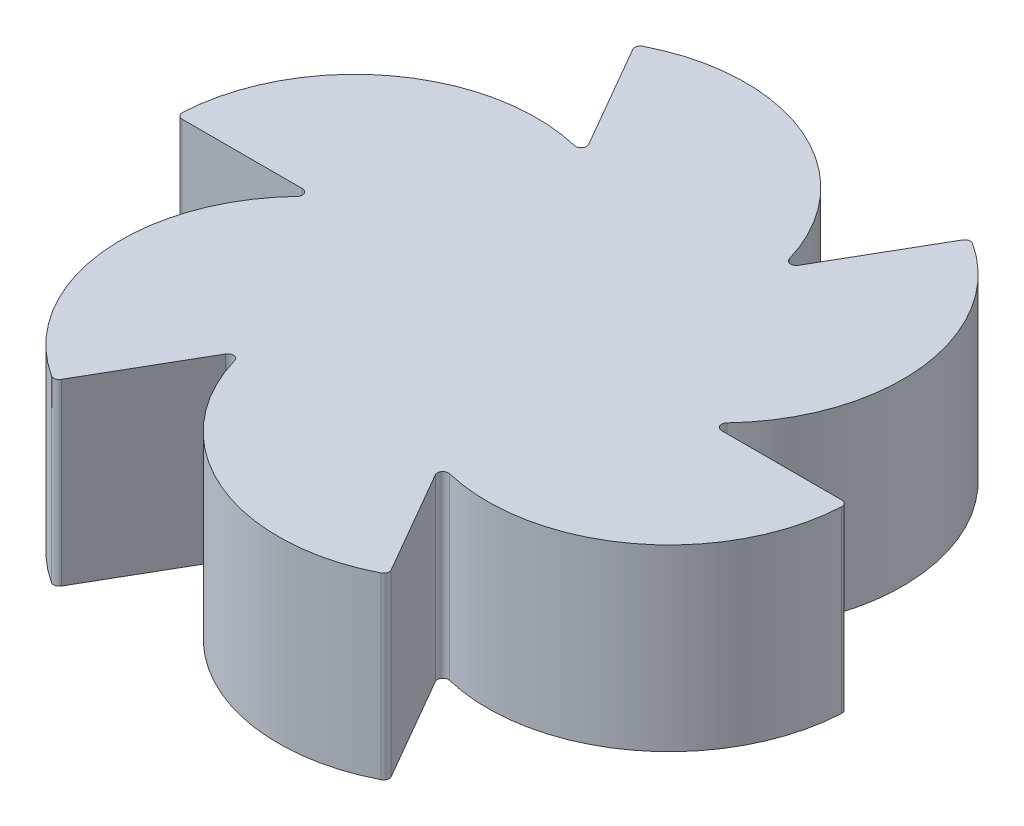
ISO-10303-21;
HEADER;
FILE_DESCRIPTION(('STEP AP214'),'2;1');
FILE_NAME('part.step','',(''),(''),'','','');
FILE_SCHEMA(('AUTOMOTIVE_DESIGN { 1 0 10303 214 1 1 1 1 }'));
ENDSEC;
DATA;
#1=APPLICATION_CONTEXT('core data for automotive mechanical design processes');
#2=APPLICATION_PROTOCOL_DEFINITION('international standard','automotive_design',2000,#1);
#3=PRODUCT_CONTEXT('',#1,'mechanical');
#4=PRODUCT('Part','Part','',(#3));
#5=PRODUCT_RELATED_PRODUCT_CATEGORY('part','',(#4));
#6=PRODUCT_DEFINITION_FORMATION('','',#4);
#7=PRODUCT_DEFINITION_CONTEXT('part definition',#1,'design');
#8=PRODUCT_DEFINITION('design','',#6,#7);
#9=PRODUCT_DEFINITION_SHAPE('','',#8);
#10=(LENGTH_UNIT() NAMED_UNIT(*) SI_UNIT(.MILLI.,.METRE.));
#11=(NAMED_UNIT(*) PLANE_ANGLE_UNIT() SI_UNIT($,.RADIAN.));
#12=(NAMED_UNIT(*) SI_UNIT($,.STERADIAN.) SOLID_ANGLE_UNIT());
#13=UNCERTAINTY_MEASURE_WITH_UNIT(LENGTH_MEASURE(1.E-05),#10,'distance_accuracy_value','');
#14=(GEOMETRIC_REPRESENTATION_CONTEXT(3) GLOBAL_UNCERTAINTY_ASSIGNED_CONTEXT((#13)) GLOBAL_UNIT_ASSIGNED_CONTEXT((#10,
#11,#12)) REPRESENTATION_CONTEXT('',''));
#15=CARTESIAN_POINT('',(0.,0.,0.));
#16=DIRECTION('',(0.,0.,1.));
#17=DIRECTION('',(1.,0.,0.));
#18=AXIS2_PLACEMENT_3D('',#15,#16,#17);
#19=CARTESIAN_POINT('',(0.,0.,0.));
#20=DIRECTION('',(0.,1.,0.));
#21=DIRECTION('',(0.,0.,1.));
#22=AXIS2_PLACEMENT_3D('',#19,#20,#21);
#23=PLANE('',#22);
#24=CARTESIAN_POINT('',(0.,0.,0.));
#25=DIRECTION('',(0.,-1.,0.));
#26=DIRECTION('',(0.,0.,-1.));
#27=AXIS2_PLACEMENT_3D('',#24,#25,#26);
#28=CIRCLE('',#27,4.3);
#29=CARTESIAN_POINT('',(0.,0.,-4.3));
#30=VERTEX_POINT('',#29);
#31=EDGE_CURVE('E448',#30,#30,#28,.T.);
#32=ORIENTED_EDGE('',*,*,#31,.T.);
#33=EDGE_LOOP('',(#32));
#34=FACE_BOUND('',#33,.T.);
#35=DIRECTION('',(0.5,0.,-0.866025403784439));
#36=VECTOR('',#35,1.);
#37=CARTESIAN_POINT('',(-2.25166604983954,0.,0.));
#38=LINE('',#37,#36);
#39=CARTESIAN_POINT('',(-2.25166604983954,0.,0.));
#40=VERTEX_POINT('',#39);
#41=CARTESIAN_POINT('',(-1.12583302491977,0.,-1.95));
#42=VERTEX_POINT('',#41);
#43=EDGE_CURVE('E445',#40,#42,#38,.T.);
#44=ORIENTED_EDGE('',*,*,#43,.F.);
#45=DIRECTION('',(-0.5,0.,-0.866025403784439));
#46=VECTOR('',#45,1.);
#47=CARTESIAN_POINT('',(-1.12583302491977,0.,1.95));
#48=LINE('',#47,#46);
#49=CARTESIAN_POINT('',(-1.12583302491977,0.,1.95));
#50=VERTEX_POINT('',#49);
#51=EDGE_CURVE('E433',#50,#40,#48,.T.);
#52=ORIENTED_EDGE('',*,*,#51,.F.);
#53=DIRECTION('',(-1.,0.,0.));
#54=VECTOR('',#53,1.);
#55=CARTESIAN_POINT('',(1.12583302491977,0.,1.95));
#56=LINE('',#55,#54);
#57=CARTESIAN_POINT('',(1.12583302491977,0.,1.95));
#58=VERTEX_POINT('',#57);
#59=EDGE_CURVE('E436',#58,#50,#56,.T.);
#60=ORIENTED_EDGE('',*,*,#59,.F.);
#61=DIRECTION('',(-0.5,0.,0.866025403784439));
#62=VECTOR('',#61,1.);
#63=CARTESIAN_POINT('',(2.25166604983954,0.,0.));
#64=LINE('',#63,#62);
#65=CARTESIAN_POINT('',(2.25166604983954,0.,0.));
#66=VERTEX_POINT('',#65);
#67=EDGE_CURVE('E440',#66,#58,#64,.T.);
#68=ORIENTED_EDGE('',*,*,#67,.F.);
#69=DIRECTION('',(0.5,0.,0.866025403784439));
#70=VECTOR('',#69,1.);
#71=CARTESIAN_POINT('',(1.12583302491977,0.,-1.95));
#72=LINE('',#71,#70);
#73=CARTESIAN_POINT('',(1.12583302491977,0.,-1.95));
#74=VERTEX_POINT('',#73);
#75=EDGE_CURVE('E148',#74,#66,#72,.T.);
#76=ORIENTED_EDGE('',*,*,#75,.F.);
#77=DIRECTION('',(1.,0.,0.));
#78=VECTOR('',#77,1.);
#79=CARTESIAN_POINT('',(-1.12583302491977,0.,-1.95));
#80=LINE('',#79,#78);
#81=EDGE_CURVE('E143',#42,#74,#80,.T.);
#82=ORIENTED_EDGE('',*,*,#81,.F.);
#83=EDGE_LOOP('',(#44,#52,#60,#68,#76,#82));
#84=FACE_BOUND('',#83,.T.);
#85=ADVANCED_FACE('F128',(#34,#84),#23,.F.);
#86=CARTESIAN_POINT('',(0.,-2.5,0.));
#87=DIRECTION('',(0.,1.,0.));
#88=DIRECTION('',(0.,0.,1.));
#89=AXIS2_PLACEMENT_3D('',#86,#87,#88);
#90=CYLINDRICAL_SURFACE('',#89,4.3);
#91=ORIENTED_EDGE('',*,*,#31,.F.);
#92=EDGE_LOOP('',(#91));
#93=FACE_BOUND('',#92,.T.);
#94=CARTESIAN_POINT('',(0.,-5.,0.));
#95=DIRECTION('',(0.,-1.,0.));
#96=DIRECTION('',(0.,0.,-1.));
#97=AXIS2_PLACEMENT_3D('',#94,#95,#96);
#98=CIRCLE('',#97,4.3);
#99=CARTESIAN_POINT('',(0.,-5.,-4.3));
#100=VERTEX_POINT('',#99);
#101=EDGE_CURVE('E349',#100,#100,#98,.T.);
#102=ORIENTED_EDGE('',*,*,#101,.T.);
#103=EDGE_LOOP('',(#102));
#104=FACE_BOUND('',#103,.T.);
#105=ADVANCED_FACE('F667',(#93,#104),#90,.F.);
#106=CARTESIAN_POINT('',(-2.25166604983954,-2.5,0.));
#107=DIRECTION('',(0.866025403784438,0.,0.5));
#108=DIRECTION('',(0.5,0.,-0.866025403784439));
#109=AXIS2_PLACEMENT_3D('',#106,#107,#108);
#110=PLANE('',#109);
#111=ORIENTED_EDGE('',*,*,#43,.T.);
#112=DIRECTION('',(0.,1.,0.));
#113=VECTOR('',#112,1.);
#114=CARTESIAN_POINT('',(-1.12583302491977,-2.5,-1.95));
#115=LINE('',#114,#113);
#116=CARTESIAN_POINT('',(-1.12583302491977,-2.5,-1.95));
#117=VERTEX_POINT('',#116);
#118=EDGE_CURVE('E415',#117,#42,#115,.T.);
#119=ORIENTED_EDGE('',*,*,#118,.F.);
#120=DIRECTION('',(0.5,0.,-0.866025403784439));
#121=VECTOR('',#120,1.);
#122=CARTESIAN_POINT('',(-2.25166604983954,-2.5,0.));
#123=LINE('',#122,#121);
#124=CARTESIAN_POINT('',(-2.25166604983954,-2.5,0.));
#125=VERTEX_POINT('',#124);
#126=EDGE_CURVE('E437',#125,#117,#123,.T.);
#127=ORIENTED_EDGE('',*,*,#126,.F.);
#128=DIRECTION('',(0.,1.,0.));
#129=VECTOR('',#128,1.);
#130=CARTESIAN_POINT('',(-2.25166604983954,-2.5,0.));
#131=LINE('',#130,#129);
#132=EDGE_CURVE('E429',#125,#40,#131,.T.);
#133=ORIENTED_EDGE('',*,*,#132,.T.);
#134=EDGE_LOOP('',(#111,#119,#127,#133));
#135=FACE_BOUND('',#134,.T.);
#136=ADVANCED_FACE('F673',(#135),#110,.F.);
#137=CARTESIAN_POINT('',(-1.12583302491977,-2.5,-1.95));
#138=DIRECTION('',(0.,0.,1.));
#139=DIRECTION('',(1.,0.,0.));
#140=AXIS2_PLACEMENT_3D('',#137,#138,#139);
#141=PLANE('',#140);
#142=ORIENTED_EDGE('',*,*,#81,.T.);
#143=DIRECTION('',(0.,1.,0.));
#144=VECTOR('',#143,1.);
#145=CARTESIAN_POINT('',(1.12583302491977,-2.5,-1.95));
#146=LINE('',#145,#144);
#147=CARTESIAN_POINT('',(1.12583302491977,-2.5,-1.95));
#148=VERTEX_POINT('',#147);
#149=EDGE_CURVE('E417',#148,#74,#146,.T.);
#150=ORIENTED_EDGE('',*,*,#149,.F.);
#151=DIRECTION('',(1.,0.,0.));
#152=VECTOR('',#151,1.);
#153=CARTESIAN_POINT('',(-1.12583302491977,-2.5,-1.95));
#154=LINE('',#153,#152);
#155=EDGE_CURVE('E456',#117,#148,#154,.T.);
#156=ORIENTED_EDGE('',*,*,#155,.F.);
#157=ORIENTED_EDGE('',*,*,#118,.T.);
#158=EDGE_LOOP('',(#142,#150,#156,#157));
#159=FACE_BOUND('',#158,.T.);
#160=ADVANCED_FACE('F1028',(#159),#141,.F.);
#161=CARTESIAN_POINT('',(1.12583302491977,-2.5,-1.95));
#162=DIRECTION('',(-0.866025403784439,0.,0.5));
#163=DIRECTION('',(0.5,0.,0.866025403784439));
#164=AXIS2_PLACEMENT_3D('',#161,#162,#163);
#165=PLANE('',#164);
#166=ORIENTED_EDGE('',*,*,#75,.T.);
#167=DIRECTION('',(0.,1.,0.));
#168=VECTOR('',#167,1.);
#169=CARTESIAN_POINT('',(2.25166604983954,-2.5,0.));
#170=LINE('',#169,#168);
#171=CARTESIAN_POINT('',(2.25166604983954,-2.5,0.));
#172=VERTEX_POINT('',#171);
#173=EDGE_CURVE('E420',#172,#66,#170,.T.);
#174=ORIENTED_EDGE('',*,*,#173,.F.);
#175=DIRECTION('',(0.5,0.,0.866025403784439));
#176=VECTOR('',#175,1.);
#177=CARTESIAN_POINT('',(1.12583302491977,-2.5,-1.95));
#178=LINE('',#177,#176);
#179=EDGE_CURVE('E454',#148,#172,#178,.T.);
#180=ORIENTED_EDGE('',*,*,#179,.F.);
#181=ORIENTED_EDGE('',*,*,#149,.T.);
#182=EDGE_LOOP('',(#166,#174,#180,#181));
#183=FACE_BOUND('',#182,.T.);
#184=ADVANCED_FACE('F1018',(#183),#165,.F.);
#185=CARTESIAN_POINT('',(2.25166604983954,-2.5,0.));
#186=DIRECTION('',(-0.866025403784439,0.,-0.5));
#187=DIRECTION('',(-0.5,0.,0.866025403784439));
#188=AXIS2_PLACEMENT_3D('',#185,#186,#187);
#189=PLANE('',#188);
#190=ORIENTED_EDGE('',*,*,#67,.T.);
#191=DIRECTION('',(0.,1.,0.));
#192=VECTOR('',#191,1.);
#193=CARTESIAN_POINT('',(1.12583302491977,-2.5,1.95));
#194=LINE('',#193,#192);
#195=CARTESIAN_POINT('',(1.12583302491977,-2.5,1.95));
#196=VERTEX_POINT('',#195);
#197=EDGE_CURVE('E423',#196,#58,#194,.T.);
#198=ORIENTED_EDGE('',*,*,#197,.F.);
#199=DIRECTION('',(-0.5,0.,0.866025403784439));
#200=VECTOR('',#199,1.);
#201=CARTESIAN_POINT('',(2.25166604983954,-2.5,0.));
#202=LINE('',#201,#200);
#203=EDGE_CURVE('E452',#172,#196,#202,.T.);
#204=ORIENTED_EDGE('',*,*,#203,.F.);
#205=ORIENTED_EDGE('',*,*,#173,.T.);
#206=EDGE_LOOP('',(#190,#198,#204,#205));
#207=FACE_BOUND('',#206,.T.);
#208=ADVANCED_FACE('F1008',(#207),#189,.F.);
#209=CARTESIAN_POINT('',(1.12583302491977,-2.5,1.95));
#210=DIRECTION('',(0.,0.,-1.));
#211=DIRECTION('',(-1.,0.,0.));
#212=AXIS2_PLACEMENT_3D('',#209,#210,#211);
#213=PLANE('',#212);
#214=ORIENTED_EDGE('',*,*,#59,.T.);
#215=DIRECTION('',(0.,1.,0.));
#216=VECTOR('',#215,1.);
#217=CARTESIAN_POINT('',(-1.12583302491977,-2.5,1.95));
#218=LINE('',#217,#216);
#219=CARTESIAN_POINT('',(-1.12583302491977,-2.5,1.95));
#220=VERTEX_POINT('',#219);
#221=EDGE_CURVE('E426',#220,#50,#218,.T.);
#222=ORIENTED_EDGE('',*,*,#221,.F.);
#223=DIRECTION('',(-1.,0.,0.));
#224=VECTOR('',#223,1.);
#225=CARTESIAN_POINT('',(1.12583302491977,-2.5,1.95));
#226=LINE('',#225,#224);
#227=EDGE_CURVE('E450',#196,#220,#226,.T.);
#228=ORIENTED_EDGE('',*,*,#227,.F.);
#229=ORIENTED_EDGE('',*,*,#197,.T.);
#230=EDGE_LOOP('',(#214,#222,#228,#229));
#231=FACE_BOUND('',#230,.T.);
#232=ADVANCED_FACE('F998',(#231),#213,.F.);
#233=CARTESIAN_POINT('',(-1.12583302491977,-2.5,1.95));
#234=DIRECTION('',(0.866025403784439,0.,-0.5));
#235=DIRECTION('',(-0.5,0.,-0.866025403784439));
#236=AXIS2_PLACEMENT_3D('',#233,#234,#235);
#237=PLANE('',#236);
#238=ORIENTED_EDGE('',*,*,#51,.T.);
#239=ORIENTED_EDGE('',*,*,#132,.F.);
#240=DIRECTION('',(-0.5,0.,-0.866025403784439));
#241=VECTOR('',#240,1.);
#242=CARTESIAN_POINT('',(-1.12583302491977,-2.5,1.95));
#243=LINE('',#242,#241);
#244=EDGE_CURVE('E432',#220,#125,#243,.T.);
#245=ORIENTED_EDGE('',*,*,#244,.F.);
#246=ORIENTED_EDGE('',*,*,#221,.T.);
#247=EDGE_LOOP('',(#238,#239,#245,#246));
#248=FACE_BOUND('',#247,.T.);
#249=ADVANCED_FACE('F988',(#248),#237,.F.);
#250=CARTESIAN_POINT('',(0.,-2.5,0.));
#251=DIRECTION('',(0.,-1.,0.));
#252=DIRECTION('',(0.,0.,-1.));
#253=AXIS2_PLACEMENT_3D('',#250,#251,#252);
#254=PLANE('',#253);
#255=ORIENTED_EDGE('',*,*,#126,.T.);
#256=ORIENTED_EDGE('',*,*,#155,.T.);
#257=ORIENTED_EDGE('',*,*,#179,.T.);
#258=ORIENTED_EDGE('',*,*,#203,.T.);
#259=ORIENTED_EDGE('',*,*,#227,.T.);
#260=ORIENTED_EDGE('',*,*,#244,.T.);
#261=EDGE_LOOP('',(#255,#256,#257,#258,#259,#260));
#262=FACE_BOUND('',#261,.T.);
#263=ADVANCED_FACE('F970',(#262),#254,.T.);
#264=CARTESIAN_POINT('',(0.,-5.,0.));
#265=DIRECTION('',(0.,-1.,0.));
#266=DIRECTION('',(0.,0.,-1.));
#267=AXIS2_PLACEMENT_3D('',#264,#265,#266);
#268=PLANE('',#267);
#269=ORIENTED_EDGE('',*,*,#101,.F.);
#270=EDGE_LOOP('',(#269));
#271=FACE_BOUND('',#270,.T.);
#272=CARTESIAN_POINT('',(7.49225968547257,-5.,-0.200000000000001));
#273=DIRECTION('',(0.,-1.,0.));
#274=DIRECTION('',(0.,0.,-1.));
#275=AXIS2_PLACEMENT_3D('',#272,#273,#274);
#276=CIRCLE('',#275,0.2);
#277=CARTESIAN_POINT('',(7.34756009987926,-5.,-0.338065310375657));
#278=VERTEX_POINT('',#277);
#279=CARTESIAN_POINT('',(7.49225968547257,-5.,0.));
#280=VERTEX_POINT('',#279);
#281=EDGE_CURVE('E327',#278,#280,#276,.F.);
#282=ORIENTED_EDGE('',*,*,#281,.T.);
#283=DIRECTION('',(1.,0.,0.));
#284=VECTOR('',#283,1.);
#285=CARTESIAN_POINT('',(0.,-5.,0.));
#286=LINE('',#285,#284);
#287=CARTESIAN_POINT('',(11.792907203773,-5.,0.));
#288=VERTEX_POINT('',#287);
#289=EDGE_CURVE('E336',#280,#288,#286,.T.);
#290=ORIENTED_EDGE('',*,*,#289,.T.);
#291=CARTESIAN_POINT('',(11.792907203773,-5.,0.2));
#292=DIRECTION('',(0.,-1.,0.));
#293=DIRECTION('',(0.,0.,-1.));
#294=AXIS2_PLACEMENT_3D('',#291,#292,#293);
#295=CIRCLE('',#294,0.2);
#296=CARTESIAN_POINT('',(11.9926456203566,-5.,0.210225700009281));
#297=VERTEX_POINT('',#296);
#298=EDGE_CURVE('E342',#288,#297,#295,.T.);
#299=ORIENTED_EDGE('',*,*,#298,.T.);
#300=CARTESIAN_POINT('',(5.50114708138987,-5.,-0.12210955029251));
#301=DIRECTION('',(0.,-1.,0.));
#302=DIRECTION('',(0.,0.,-1.));
#303=AXIS2_PLACEMENT_3D('',#300,#301,#302);
#304=CIRCLE('',#303,6.5);
#305=CARTESIAN_POINT('',(3.96655319686323,-5.,6.19414104714054));
#306=VERTEX_POINT('',#305);
#307=EDGE_CURVE('E355',#297,#306,#304,.T.);
#308=ORIENTED_EDGE('',*,*,#307,.T.);
#309=CARTESIAN_POINT('',(3.91933492349318,-5.,6.38848721936925));
#310=DIRECTION('',(0.,-1.,0.));
#311=DIRECTION('',(0.,0.,-1.));
#312=AXIS2_PLACEMENT_3D('',#309,#310,#311);
#313=CIRCLE('',#312,0.2);
#314=CARTESIAN_POINT('',(3.74612984273629,-5.,6.48848721936925));
#315=VERTEX_POINT('',#314);
#316=EDGE_CURVE('E358',#306,#315,#313,.F.);
#317=ORIENTED_EDGE('',*,*,#316,.T.);
#318=DIRECTION('',(0.5,0.,0.866025403784438));
#319=VECTOR('',#318,1.);
#320=CARTESIAN_POINT('',(0.,-5.,0.));
#321=LINE('',#320,#319);
#322=CARTESIAN_POINT('',(5.8964536018865,-5.,10.2129572229399));
#323=VERTEX_POINT('',#322);
#324=EDGE_CURVE('E361',#315,#323,#321,.T.);
#325=ORIENTED_EDGE('',*,*,#324,.T.);
#326=CARTESIAN_POINT('',(5.72324852112961,-5.,10.3129572229399));
#327=DIRECTION('',(0.,-1.,0.));
#328=DIRECTION('',(0.,0.,-1.));
#329=AXIS2_PLACEMENT_3D('',#326,#327,#328);
#330=CIRCLE('',#329,0.2);
#331=CARTESIAN_POINT('',(5.81426201344189,-5.,10.4910486158176));
#332=VERTEX_POINT('',#331);
#333=EDGE_CURVE('E364',#323,#332,#330,.T.);
#334=ORIENTED_EDGE('',*,*,#333,.T.);
#335=CARTESIAN_POINT('',(2.85632351329295,-5.,4.703078347292));
#336=DIRECTION('',(0.,-1.,0.));
#337=DIRECTION('',(0.,0.,-1.));
#338=AXIS2_PLACEMENT_3D('',#335,#336,#337);
#339=CIRCLE('',#338,6.5);
#340=CARTESIAN_POINT('',(-3.38100690301604,-5.,6.5322063575162));
#341=VERTEX_POINT('',#340);
#342=EDGE_CURVE('E367',#332,#341,#339,.T.);
#343=ORIENTED_EDGE('',*,*,#342,.T.);
#344=CARTESIAN_POINT('',(-3.57292476197939,-5.,6.58848721936925));
#345=DIRECTION('',(0.,-1.,0.));
#346=DIRECTION('',(0.,0.,-1.));
#347=AXIS2_PLACEMENT_3D('',#344,#345,#346);
#348=CIRCLE('',#347,0.2);
#349=CARTESIAN_POINT('',(-3.74612984273628,-5.,6.48848721936926));
#350=VERTEX_POINT('',#349);
#351=EDGE_CURVE('E370',#341,#350,#348,.F.);
#352=ORIENTED_EDGE('',*,*,#351,.T.);
#353=DIRECTION('',(-0.5,0.,0.866025403784439));
#354=VECTOR('',#353,1.);
#355=CARTESIAN_POINT('',(0.,-5.,0.));
#356=LINE('',#355,#354);
#357=CARTESIAN_POINT('',(-5.89645360188649,-5.,10.2129572229399));
#358=VERTEX_POINT('',#357);
#359=EDGE_CURVE('E373',#350,#358,#356,.T.);
#360=ORIENTED_EDGE('',*,*,#359,.T.);
#361=CARTESIAN_POINT('',(-6.06965868264337,-5.,10.1129572229399));
#362=DIRECTION('',(0.,-1.,0.));
#363=DIRECTION('',(0.,0.,-1.));
#364=AXIS2_PLACEMENT_3D('',#361,#362,#363);
#365=CIRCLE('',#364,0.2);
#366=CARTESIAN_POINT('',(-6.17838360691469,-5.,10.2808229158083));
#367=VERTEX_POINT('',#366);
#368=EDGE_CURVE('E376',#358,#367,#365,.T.);
#369=ORIENTED_EDGE('',*,*,#368,.T.);
#370=CARTESIAN_POINT('',(-2.64482356809693,-5.,4.82518789758451));
#371=DIRECTION('',(0.,-1.,0.));
#372=DIRECTION('',(0.,0.,-1.));
#373=AXIS2_PLACEMENT_3D('',#370,#371,#372);
#374=CIRCLE('',#373,6.5);
#375=CARTESIAN_POINT('',(-7.34756009987926,-5.,0.338065310375657));
#376=VERTEX_POINT('',#375);
#377=EDGE_CURVE('E379',#367,#376,#374,.T.);
#378=ORIENTED_EDGE('',*,*,#377,.T.);
#379=CARTESIAN_POINT('',(-7.49225968547257,-5.,0.2));
#380=DIRECTION('',(0.,-1.,0.));
#381=DIRECTION('',(0.,0.,-1.));
#382=AXIS2_PLACEMENT_3D('',#379,#380,#381);
#383=CIRCLE('',#382,0.2);
#384=CARTESIAN_POINT('',(-7.49225968547257,-5.,0.));
#385=VERTEX_POINT('',#384);
#386=EDGE_CURVE('E382',#376,#385,#383,.F.);
#387=ORIENTED_EDGE('',*,*,#386,.T.);
#388=DIRECTION('',(-1.,0.,0.));
#389=VECTOR('',#388,1.);
#390=CARTESIAN_POINT('',(0.,-5.,0.));
#391=LINE('',#390,#389);
#392=CARTESIAN_POINT('',(-11.792907203773,-5.,0.));
#393=VERTEX_POINT('',#392);
#394=EDGE_CURVE('E385',#385,#393,#391,.T.);
#395=ORIENTED_EDGE('',*,*,#394,.T.);
#396=CARTESIAN_POINT('',(-11.792907203773,-5.,-0.2));
#397=DIRECTION('',(0.,-1.,0.));
#398=DIRECTION('',(0.,0.,-1.));
#399=AXIS2_PLACEMENT_3D('',#396,#397,#398);
#400=CIRCLE('',#399,0.2);
#401=CARTESIAN_POINT('',(-11.9926456203566,-5.,-0.210225700009286));
#402=VERTEX_POINT('',#401);
#403=EDGE_CURVE('E388',#393,#402,#400,.T.);
#404=ORIENTED_EDGE('',*,*,#403,.T.);
#405=CARTESIAN_POINT('',(-5.50114708138987,-5.,0.122109550292509));
#406=DIRECTION('',(0.,-1.,0.));
#407=DIRECTION('',(0.,0.,-1.));
#408=AXIS2_PLACEMENT_3D('',#405,#406,#407);
#409=CIRCLE('',#408,6.5);
#410=CARTESIAN_POINT('',(-3.96655319686322,-5.,-6.19414104714054));
#411=VERTEX_POINT('',#410);
#412=EDGE_CURVE('E391',#402,#411,#409,.T.);
#413=ORIENTED_EDGE('',*,*,#412,.T.);
#414=CARTESIAN_POINT('',(-3.91933492349317,-5.,-6.38848721936925));
#415=DIRECTION('',(0.,-1.,0.));
#416=DIRECTION('',(0.,0.,-1.));
#417=AXIS2_PLACEMENT_3D('',#414,#415,#416);
#418=CIRCLE('',#417,0.2);
#419=CARTESIAN_POINT('',(-3.74612984273628,-5.,-6.48848721936925));
#420=VERTEX_POINT('',#419);
#421=EDGE_CURVE('E394',#411,#420,#418,.F.);
#422=ORIENTED_EDGE('',*,*,#421,.T.);
#423=DIRECTION('',(-0.5,0.,-0.866025403784438));
#424=VECTOR('',#423,1.);
#425=CARTESIAN_POINT('',(0.,-5.,0.));
#426=LINE('',#425,#424);
#427=CARTESIAN_POINT('',(-5.89645360188649,-5.,-10.2129572229399));
#428=VERTEX_POINT('',#427);
#429=EDGE_CURVE('E397',#420,#428,#426,.T.);
#430=ORIENTED_EDGE('',*,*,#429,.T.);
#431=CARTESIAN_POINT('',(-5.72324852112961,-5.,-10.3129572229399));
#432=DIRECTION('',(0.,-1.,0.));
#433=DIRECTION('',(0.,0.,-1.));
#434=AXIS2_PLACEMENT_3D('',#431,#432,#433);
#435=CIRCLE('',#434,0.2);
#436=CARTESIAN_POINT('',(-5.81426201344188,-5.,-10.4910486158176));
#437=VERTEX_POINT('',#436);
#438=EDGE_CURVE('E400',#428,#437,#435,.T.);
#439=ORIENTED_EDGE('',*,*,#438,.T.);
#440=CARTESIAN_POINT('',(-2.85632351329294,-5.,-4.703078347292));
#441=DIRECTION('',(0.,-1.,0.));
#442=DIRECTION('',(0.,0.,-1.));
#443=AXIS2_PLACEMENT_3D('',#440,#441,#442);
#444=CIRCLE('',#443,6.5);
#445=CARTESIAN_POINT('',(3.38100690301604,-5.,-6.5322063575162));
#446=VERTEX_POINT('',#445);
#447=EDGE_CURVE('E403',#437,#446,#444,.T.);
#448=ORIENTED_EDGE('',*,*,#447,.T.);
#449=CARTESIAN_POINT('',(3.57292476197939,-5.,-6.58848721936925));
#450=DIRECTION('',(0.,-1.,0.));
#451=DIRECTION('',(0.,0.,-1.));
#452=AXIS2_PLACEMENT_3D('',#449,#450,#451);
#453=CIRCLE('',#452,0.2);
#454=CARTESIAN_POINT('',(3.74612984273628,-5.,-6.48848721936926));
#455=VERTEX_POINT('',#454);
#456=EDGE_CURVE('E406',#446,#455,#453,.F.);
#457=ORIENTED_EDGE('',*,*,#456,.T.);
#458=DIRECTION('',(0.5,0.,-0.866025403784439));
#459=VECTOR('',#458,1.);
#460=CARTESIAN_POINT('',(0.,-5.,0.));
#461=LINE('',#460,#459);
#462=CARTESIAN_POINT('',(5.89645360188649,-5.,-10.2129572229399));
#463=VERTEX_POINT('',#462);
#464=EDGE_CURVE('E409',#455,#463,#461,.T.);
#465=ORIENTED_EDGE('',*,*,#464,.T.);
#466=CARTESIAN_POINT('',(6.06965868264338,-5.,-10.1129572229399));
#467=DIRECTION('',(0.,-1.,0.));
#468=DIRECTION('',(0.,0.,-1.));
#469=AXIS2_PLACEMENT_3D('',#466,#467,#468);
#470=CIRCLE('',#469,0.2);
#471=CARTESIAN_POINT('',(6.17838360691469,-5.,-10.2808229158083));
#472=VERTEX_POINT('',#471);
#473=EDGE_CURVE('E412',#463,#472,#470,.T.);
#474=ORIENTED_EDGE('',*,*,#473,.T.);
#475=CARTESIAN_POINT('',(2.64482356809693,-5.,-4.82518789758451));
#476=DIRECTION('',(0.,-1.,0.));
#477=DIRECTION('',(0.,0.,-1.));
#478=AXIS2_PLACEMENT_3D('',#475,#476,#477);
#479=CIRCLE('',#478,6.5);
#480=EDGE_CURVE('E348',#472,#278,#479,.T.);
#481=ORIENTED_EDGE('',*,*,#480,.T.);
#482=EDGE_LOOP('',(#282,#290,#299,#308,#317,#325,#334,#343,#352,#360,#369,#378,#387,#395,#404,
#413,#422,#430,#439,#448,#457,#465,#474,#481));
#483=FACE_BOUND('',#482,.T.);
#484=ADVANCED_FACE('F345',(#271,#483),#268,.T.);
#485=CARTESIAN_POINT('',(0.,1.4,0.));
#486=DIRECTION('',(0.,1.,0.));
#487=DIRECTION('',(0.,0.,1.));
#488=AXIS2_PLACEMENT_3D('',#485,#486,#487);
#489=PLANE('',#488);
#490=CARTESIAN_POINT('',(5.50114708138987,1.4,-0.12210955029251));
#491=DIRECTION('',(0.,1.,0.));
#492=DIRECTION('',(0.,0.,1.));
#493=AXIS2_PLACEMENT_3D('',#490,#491,#492);
#494=CIRCLE('',#493,6.5);
#495=CARTESIAN_POINT('',(11.9926456203566,1.4,0.210225700009286));
#496=VERTEX_POINT('',#495);
#497=CARTESIAN_POINT('',(3.96655319686323,1.4,6.19414104714054));
#498=VERTEX_POINT('',#497);
#499=EDGE_CURVE('E474',#496,#498,#494,.F.);
#500=ORIENTED_EDGE('',*,*,#499,.F.);
#501=CARTESIAN_POINT('',(11.792907203773,1.4,0.2));
#502=DIRECTION('',(0.,1.,0.));
#503=DIRECTION('',(0.,0.,1.));
#504=AXIS2_PLACEMENT_3D('',#501,#502,#503);
#505=CIRCLE('',#504,0.2);
#506=CARTESIAN_POINT('',(11.792907203773,1.4,0.));
#507=VERTEX_POINT('',#506);
#508=EDGE_CURVE('E515',#496,#507,#505,.T.);
#509=ORIENTED_EDGE('',*,*,#508,.T.);
#510=DIRECTION('',(-1.,0.,0.));
#511=VECTOR('',#510,1.);
#512=CARTESIAN_POINT('',(0.,1.4,0.));
#513=LINE('',#512,#511);
#514=CARTESIAN_POINT('',(7.49225968547257,1.4,0.));
#515=VERTEX_POINT('',#514);
#516=EDGE_CURVE('E477',#507,#515,#513,.T.);
#517=ORIENTED_EDGE('',*,*,#516,.T.);
#518=CARTESIAN_POINT('',(7.49225968547257,1.4,-0.200000000000001));
#519=DIRECTION('',(0.,1.,0.));
#520=DIRECTION('',(0.,0.,1.));
#521=AXIS2_PLACEMENT_3D('',#518,#519,#520);
#522=CIRCLE('',#521,0.2);
#523=CARTESIAN_POINT('',(7.34756009987926,1.4,-0.338065310375658));
#524=VERTEX_POINT('',#523);
#525=EDGE_CURVE('E328',#515,#524,#522,.F.);
#526=ORIENTED_EDGE('',*,*,#525,.T.);
#527=CARTESIAN_POINT('',(2.64482356809693,1.4,-4.82518789758451));
#528=DIRECTION('',(0.,1.,0.));
#529=DIRECTION('',(0.,0.,1.));
#530=AXIS2_PLACEMENT_3D('',#527,#528,#529);
#531=CIRCLE('',#530,6.5);
#532=CARTESIAN_POINT('',(6.17838360691469,1.4,-10.2808229158083));
#533=VERTEX_POINT('',#532);
#534=EDGE_CURVE('E479',#533,#524,#531,.F.);
#535=ORIENTED_EDGE('',*,*,#534,.F.);
#536=CARTESIAN_POINT('',(6.06965868264338,1.4,-10.1129572229399));
#537=DIRECTION('',(0.,1.,0.));
#538=DIRECTION('',(0.,0.,1.));
#539=AXIS2_PLACEMENT_3D('',#536,#537,#538);
#540=CIRCLE('',#539,0.2);
#541=CARTESIAN_POINT('',(5.89645360188649,1.4,-10.2129572229399));
#542=VERTEX_POINT('',#541);
#543=EDGE_CURVE('E505',#533,#542,#540,.T.);
#544=ORIENTED_EDGE('',*,*,#543,.T.);
#545=DIRECTION('',(-0.5,0.,0.866025403784439));
#546=VECTOR('',#545,1.);
#547=CARTESIAN_POINT('',(0.,1.4,0.));
#548=LINE('',#547,#546);
#549=CARTESIAN_POINT('',(3.74612984273628,1.4,-6.48848721936925));
#550=VERTEX_POINT('',#549);
#551=EDGE_CURVE('E482',#542,#550,#548,.T.);
#552=ORIENTED_EDGE('',*,*,#551,.T.);
#553=CARTESIAN_POINT('',(3.57292476197939,1.4,-6.58848721936925));
#554=DIRECTION('',(0.,1.,0.));
#555=DIRECTION('',(0.,0.,1.));
#556=AXIS2_PLACEMENT_3D('',#553,#554,#555);
#557=CIRCLE('',#556,0.2);
#558=CARTESIAN_POINT('',(3.38100690301604,1.4,-6.5322063575162));
#559=VERTEX_POINT('',#558);
#560=EDGE_CURVE('E12',#550,#559,#557,.F.);
#561=ORIENTED_EDGE('',*,*,#560,.T.);
#562=CARTESIAN_POINT('',(-2.85632351329294,1.4,-4.703078347292));
#563=DIRECTION('',(0.,1.,0.));
#564=DIRECTION('',(0.,0.,1.));
#565=AXIS2_PLACEMENT_3D('',#562,#563,#564);
#566=CIRCLE('',#565,6.5);
#567=CARTESIAN_POINT('',(-5.81426201344188,1.4,-10.4910486158176));
#568=VERTEX_POINT('',#567);
#569=EDGE_CURVE('E485',#568,#559,#566,.F.);
#570=ORIENTED_EDGE('',*,*,#569,.F.);
#571=CARTESIAN_POINT('',(-5.72324852112961,1.4,-10.3129572229399));
#572=DIRECTION('',(0.,1.,0.));
#573=DIRECTION('',(0.,0.,1.));
#574=AXIS2_PLACEMENT_3D('',#571,#572,#573);
#575=CIRCLE('',#574,0.2);
#576=CARTESIAN_POINT('',(-5.89645360188649,1.4,-10.2129572229399));
#577=VERTEX_POINT('',#576);
#578=EDGE_CURVE('E507',#568,#577,#575,.T.);
#579=ORIENTED_EDGE('',*,*,#578,.T.);
#580=DIRECTION('',(0.5,0.,0.866025403784438));
#581=VECTOR('',#580,1.);
#582=CARTESIAN_POINT('',(0.,1.4,0.));
#583=LINE('',#582,#581);
#584=CARTESIAN_POINT('',(-3.74612984273628,1.4,-6.48848721936925));
#585=VERTEX_POINT('',#584);
#586=EDGE_CURVE('E488',#577,#585,#583,.T.);
#587=ORIENTED_EDGE('',*,*,#586,.T.);
#588=CARTESIAN_POINT('',(-3.91933492349317,1.4,-6.38848721936925));
#589=DIRECTION('',(0.,1.,0.));
#590=DIRECTION('',(0.,0.,1.));
#591=AXIS2_PLACEMENT_3D('',#588,#589,#590);
#592=CIRCLE('',#591,0.2);
#593=CARTESIAN_POINT('',(-3.96655319686322,1.4,-6.19414104714054));
#594=VERTEX_POINT('',#593);
#595=EDGE_CURVE('E136',#585,#594,#592,.F.);
#596=ORIENTED_EDGE('',*,*,#595,.T.);
#597=CARTESIAN_POINT('',(-5.50114708138987,1.4,0.122109550292509));
#598=DIRECTION('',(0.,1.,0.));
#599=DIRECTION('',(0.,0.,1.));
#600=AXIS2_PLACEMENT_3D('',#597,#598,#599);
#601=CIRCLE('',#600,6.5);
#602=CARTESIAN_POINT('',(-11.9926456203566,1.4,-0.210225700009286));
#603=VERTEX_POINT('',#602);
#604=EDGE_CURVE('E491',#603,#594,#601,.F.);
#605=ORIENTED_EDGE('',*,*,#604,.F.);
#606=CARTESIAN_POINT('',(-11.792907203773,1.4,-0.2));
#607=DIRECTION('',(0.,1.,0.));
#608=DIRECTION('',(0.,0.,1.));
#609=AXIS2_PLACEMENT_3D('',#606,#607,#608);
#610=CIRCLE('',#609,0.2);
#611=CARTESIAN_POINT('',(-11.792907203773,1.4,0.));
#612=VERTEX_POINT('',#611);
#613=EDGE_CURVE('E509',#603,#612,#610,.T.);
#614=ORIENTED_EDGE('',*,*,#613,.T.);
#615=DIRECTION('',(1.,0.,0.));
#616=VECTOR('',#615,1.);
#617=CARTESIAN_POINT('',(0.,1.4,0.));
#618=LINE('',#617,#616);
#619=CARTESIAN_POINT('',(-7.49225968547257,1.4,0.));
#620=VERTEX_POINT('',#619);
#621=EDGE_CURVE('E494',#612,#620,#618,.T.);
#622=ORIENTED_EDGE('',*,*,#621,.T.);
#623=CARTESIAN_POINT('',(-7.49225968547257,1.4,0.2));
#624=DIRECTION('',(0.,1.,0.));
#625=DIRECTION('',(0.,0.,1.));
#626=AXIS2_PLACEMENT_3D('',#623,#624,#625);
#627=CIRCLE('',#626,0.2);
#628=CARTESIAN_POINT('',(-7.34756009987926,1.4,0.338065310375657));
#629=VERTEX_POINT('',#628);
#630=EDGE_CURVE('E558',#620,#629,#627,.F.);
#631=ORIENTED_EDGE('',*,*,#630,.T.);
#632=CARTESIAN_POINT('',(-2.64482356809693,1.4,4.82518789758451));
#633=DIRECTION('',(0.,1.,0.));
#634=DIRECTION('',(0.,0.,1.));
#635=AXIS2_PLACEMENT_3D('',#632,#633,#634);
#636=CIRCLE('',#635,6.5);
#637=CARTESIAN_POINT('',(-6.17838360691469,1.4,10.2808229158083));
#638=VERTEX_POINT('',#637);
#639=EDGE_CURVE('E462',#638,#629,#636,.F.);
#640=ORIENTED_EDGE('',*,*,#639,.F.);
#641=CARTESIAN_POINT('',(-6.06965868264337,1.4,10.1129572229399));
#642=DIRECTION('',(0.,1.,0.));
#643=DIRECTION('',(0.,0.,1.));
#644=AXIS2_PLACEMENT_3D('',#641,#642,#643);
#645=CIRCLE('',#644,0.2);
#646=CARTESIAN_POINT('',(-5.89645360188649,1.4,10.2129572229399));
#647=VERTEX_POINT('',#646);
#648=EDGE_CURVE('E511',#638,#647,#645,.T.);
#649=ORIENTED_EDGE('',*,*,#648,.T.);
#650=DIRECTION('',(0.5,0.,-0.866025403784439));
#651=VECTOR('',#650,1.);
#652=CARTESIAN_POINT('',(0.,1.4,0.));
#653=LINE('',#652,#651);
#654=CARTESIAN_POINT('',(-3.74612984273628,1.4,6.48848721936926));
#655=VERTEX_POINT('',#654);
#656=EDGE_CURVE('E465',#647,#655,#653,.T.);
#657=ORIENTED_EDGE('',*,*,#656,.T.);
#658=CARTESIAN_POINT('',(-3.57292476197939,1.4,6.58848721936925));
#659=DIRECTION('',(0.,1.,0.));
#660=DIRECTION('',(0.,0.,1.));
#661=AXIS2_PLACEMENT_3D('',#658,#659,#660);
#662=CIRCLE('',#661,0.2);
#663=CARTESIAN_POINT('',(-3.38100690301604,1.4,6.5322063575162));
#664=VERTEX_POINT('',#663);
#665=EDGE_CURVE('E556',#655,#664,#662,.F.);
#666=ORIENTED_EDGE('',*,*,#665,.T.);
#667=CARTESIAN_POINT('',(2.85632351329295,1.4,4.703078347292));
#668=DIRECTION('',(0.,1.,0.));
#669=DIRECTION('',(0.,0.,1.));
#670=AXIS2_PLACEMENT_3D('',#667,#668,#669);
#671=CIRCLE('',#670,6.5);
#672=CARTESIAN_POINT('',(5.81426201344188,1.4,10.4910486158176));
#673=VERTEX_POINT('',#672);
#674=EDGE_CURVE('E468',#673,#664,#671,.F.);
#675=ORIENTED_EDGE('',*,*,#674,.F.);
#676=CARTESIAN_POINT('',(5.72324852112961,1.4,10.3129572229399));
#677=DIRECTION('',(0.,1.,0.));
#678=DIRECTION('',(0.,0.,1.));
#679=AXIS2_PLACEMENT_3D('',#676,#677,#678);
#680=CIRCLE('',#679,0.2);
#681=CARTESIAN_POINT('',(5.8964536018865,1.4,10.2129572229399));
#682=VERTEX_POINT('',#681);
#683=EDGE_CURVE('E513',#673,#682,#680,.T.);
#684=ORIENTED_EDGE('',*,*,#683,.T.);
#685=DIRECTION('',(-0.5,0.,-0.866025403784438));
#686=VECTOR('',#685,1.);
#687=CARTESIAN_POINT('',(0.,1.4,0.));
#688=LINE('',#687,#686);
#689=CARTESIAN_POINT('',(3.74612984273629,1.4,6.48848721936925));
#690=VERTEX_POINT('',#689);
#691=EDGE_CURVE('E471',#682,#690,#688,.T.);
#692=ORIENTED_EDGE('',*,*,#691,.T.);
#693=CARTESIAN_POINT('',(3.91933492349318,1.4,6.38848721936925));
#694=DIRECTION('',(0.,1.,0.));
#695=DIRECTION('',(0.,0.,1.));
#696=AXIS2_PLACEMENT_3D('',#693,#694,#695);
#697=CIRCLE('',#696,0.2);
#698=EDGE_CURVE('E554',#690,#498,#697,.F.);
#699=ORIENTED_EDGE('',*,*,#698,.T.);
#700=EDGE_LOOP('',(#500,#509,#517,#526,#535,#544,#552,#561,#570,#579,#587,#596,#605,#614,#622,
#631,#640,#649,#657,#666,#675,#684,#692,#699));
#701=FACE_BOUND('',#700,.T.);
#702=ADVANCED_FACE('F563',(#701),#489,.T.);
#703=CARTESIAN_POINT('',(2.64482356809693,1.4,-4.82518789758451));
#704=DIRECTION('',(0.,-1.,0.));
#705=DIRECTION('',(0.,0.,-1.));
#706=AXIS2_PLACEMENT_3D('',#703,#704,#705);
#707=CYLINDRICAL_SURFACE('',#706,6.5);
#708=DIRECTION('',(0.,-1.,0.));
#709=VECTOR('',#708,1.);
#710=CARTESIAN_POINT('',(6.17838360691469,1.4,-10.2808229158083));
#711=LINE('',#710,#709);
#712=EDGE_CURVE('E497',#472,#533,#711,.F.);
#713=ORIENTED_EDGE('',*,*,#712,.T.);
#714=ORIENTED_EDGE('',*,*,#534,.T.);
#715=DIRECTION('',(0.,-1.,0.));
#716=VECTOR('',#715,1.);
#717=CARTESIAN_POINT('',(7.34756009987926,1.4,-0.338065310375657));
#718=LINE('',#717,#716);
#719=EDGE_CURVE('E499',#524,#278,#718,.T.);
#720=ORIENTED_EDGE('',*,*,#719,.T.);
#721=ORIENTED_EDGE('',*,*,#480,.F.);
#722=EDGE_LOOP('',(#713,#714,#720,#721));
#723=FACE_BOUND('',#722,.T.);
#724=ADVANCED_FACE('F599',(#723),#707,.T.);
#725=CARTESIAN_POINT('',(6.06965868264338,1.4,-10.1129572229399));
#726=DIRECTION('',(0.,-1.,0.));
#727=DIRECTION('',(0.,0.,-1.));
#728=AXIS2_PLACEMENT_3D('',#725,#726,#727);
#729=CYLINDRICAL_SURFACE('',#728,0.2);
#730=ORIENTED_EDGE('',*,*,#473,.F.);
#731=DIRECTION('',(0.,1.,0.));
#732=VECTOR('',#731,1.);
#733=CARTESIAN_POINT('',(5.89645360188649,0.,-10.2129572229399));
#734=LINE('',#733,#732);
#735=EDGE_CURVE('E549',#542,#463,#734,.F.);
#736=ORIENTED_EDGE('',*,*,#735,.F.);
#737=ORIENTED_EDGE('',*,*,#543,.F.);
#738=ORIENTED_EDGE('',*,*,#712,.F.);
#739=EDGE_LOOP('',(#730,#736,#737,#738));
#740=FACE_BOUND('',#739,.T.);
#741=ADVANCED_FACE('F130',(#740),#729,.T.);
#742=CARTESIAN_POINT('',(0.,1.4,0.));
#743=DIRECTION('',(0.866025403784439,0.,0.5));
#744=DIRECTION('',(0.5,0.,-0.866025403784439));
#745=AXIS2_PLACEMENT_3D('',#742,#743,#744);
#746=PLANE('',#745);
#747=DIRECTION('',(0.,-1.,0.));
#748=VECTOR('',#747,1.);
#749=CARTESIAN_POINT('',(3.74612984273628,1.4,-6.48848721936925));
#750=LINE('',#749,#748);
#751=EDGE_CURVE('E551',#455,#550,#750,.F.);
#752=ORIENTED_EDGE('',*,*,#751,.T.);
#753=ORIENTED_EDGE('',*,*,#551,.F.);
#754=ORIENTED_EDGE('',*,*,#735,.T.);
#755=ORIENTED_EDGE('',*,*,#464,.F.);
#756=EDGE_LOOP('',(#752,#753,#754,#755));
#757=FACE_BOUND('',#756,.T.);
#758=ADVANCED_FACE('F593',(#757),#746,.F.);
#759=CARTESIAN_POINT('',(3.57292476197939,1.4,-6.58848721936925));
#760=DIRECTION('',(0.,-1.,0.));
#761=DIRECTION('',(0.,0.,-1.));
#762=AXIS2_PLACEMENT_3D('',#759,#760,#761);
#763=CYLINDRICAL_SURFACE('',#762,0.2);
#764=ORIENTED_EDGE('',*,*,#456,.F.);
#765=DIRECTION('',(0.,-1.,0.));
#766=VECTOR('',#765,1.);
#767=CARTESIAN_POINT('',(3.38100690301604,1.4,-6.5322063575162));
#768=LINE('',#767,#766);
#769=EDGE_CURVE('E545',#559,#446,#768,.T.);
#770=ORIENTED_EDGE('',*,*,#769,.F.);
#771=ORIENTED_EDGE('',*,*,#560,.F.);
#772=ORIENTED_EDGE('',*,*,#751,.F.);
#773=EDGE_LOOP('',(#764,#770,#771,#772));
#774=FACE_BOUND('',#773,.T.);
#775=ADVANCED_FACE('F589',(#774),#763,.F.);
#776=CARTESIAN_POINT('',(-2.85632351329294,1.4,-4.703078347292));
#777=DIRECTION('',(0.,-1.,0.));
#778=DIRECTION('',(0.,0.,-1.));
#779=AXIS2_PLACEMENT_3D('',#776,#777,#778);
#780=CYLINDRICAL_SURFACE('',#779,6.5);
#781=DIRECTION('',(0.,-1.,0.));
#782=VECTOR('',#781,1.);
#783=CARTESIAN_POINT('',(-5.81426201344188,1.4,-10.4910486158176));
#784=LINE('',#783,#782);
#785=EDGE_CURVE('E547',#437,#568,#784,.F.);
#786=ORIENTED_EDGE('',*,*,#785,.T.);
#787=ORIENTED_EDGE('',*,*,#569,.T.);
#788=ORIENTED_EDGE('',*,*,#769,.T.);
#789=ORIENTED_EDGE('',*,*,#447,.F.);
#790=EDGE_LOOP('',(#786,#787,#788,#789));
#791=FACE_BOUND('',#790,.T.);
#792=ADVANCED_FACE('F584',(#791),#780,.T.);
#793=CARTESIAN_POINT('',(-5.72324852112961,1.4,-10.3129572229399));
#794=DIRECTION('',(0.,-1.,0.));
#795=DIRECTION('',(0.,0.,-1.));
#796=AXIS2_PLACEMENT_3D('',#793,#794,#795);
#797=CYLINDRICAL_SURFACE('',#796,0.2);
#798=ORIENTED_EDGE('',*,*,#438,.F.);
#799=DIRECTION('',(0.,1.,0.));
#800=VECTOR('',#799,1.);
#801=CARTESIAN_POINT('',(-5.89645360188649,0.,-10.2129572229399));
#802=LINE('',#801,#800);
#803=EDGE_CURVE('E541',#577,#428,#802,.F.);
#804=ORIENTED_EDGE('',*,*,#803,.F.);
#805=ORIENTED_EDGE('',*,*,#578,.F.);
#806=ORIENTED_EDGE('',*,*,#785,.F.);
#807=EDGE_LOOP('',(#798,#804,#805,#806));
#808=FACE_BOUND('',#807,.T.);
#809=ADVANCED_FACE('F580',(#808),#797,.T.);
#810=CARTESIAN_POINT('',(0.,1.4,0.));
#811=DIRECTION('',(0.866025403784438,0.,-0.5));
#812=DIRECTION('',(-0.5,0.,-0.866025403784438));
#813=AXIS2_PLACEMENT_3D('',#810,#811,#812);
#814=PLANE('',#813);
#815=DIRECTION('',(0.,-1.,0.));
#816=VECTOR('',#815,1.);
#817=CARTESIAN_POINT('',(-3.74612984273628,1.4,-6.48848721936925));
#818=LINE('',#817,#816);
#819=EDGE_CURVE('E543',#420,#585,#818,.F.);
#820=ORIENTED_EDGE('',*,*,#819,.T.);
#821=ORIENTED_EDGE('',*,*,#586,.F.);
#822=ORIENTED_EDGE('',*,*,#803,.T.);
#823=ORIENTED_EDGE('',*,*,#429,.F.);
#824=EDGE_LOOP('',(#820,#821,#822,#823));
#825=FACE_BOUND('',#824,.T.);
#826=ADVANCED_FACE('F576',(#825),#814,.F.);
#827=CARTESIAN_POINT('',(-3.91933492349317,1.4,-6.38848721936925));
#828=DIRECTION('',(0.,-1.,0.));
#829=DIRECTION('',(0.,0.,-1.));
#830=AXIS2_PLACEMENT_3D('',#827,#828,#829);
#831=CYLINDRICAL_SURFACE('',#830,0.2);
#832=ORIENTED_EDGE('',*,*,#421,.F.);
#833=DIRECTION('',(0.,-1.,0.));
#834=VECTOR('',#833,1.);
#835=CARTESIAN_POINT('',(-3.96655319686322,1.4,-6.19414104714054));
#836=LINE('',#835,#834);
#837=EDGE_CURVE('E537',#594,#411,#836,.T.);
#838=ORIENTED_EDGE('',*,*,#837,.F.);
#839=ORIENTED_EDGE('',*,*,#595,.F.);
#840=ORIENTED_EDGE('',*,*,#819,.F.);
#841=EDGE_LOOP('',(#832,#838,#839,#840));
#842=FACE_BOUND('',#841,.T.);
#843=ADVANCED_FACE('F572',(#842),#831,.F.);
#844=CARTESIAN_POINT('',(-5.50114708138987,1.4,0.122109550292509));
#845=DIRECTION('',(0.,-1.,0.));
#846=DIRECTION('',(0.,0.,-1.));
#847=AXIS2_PLACEMENT_3D('',#844,#845,#846);
#848=CYLINDRICAL_SURFACE('',#847,6.5);
#849=DIRECTION('',(0.,-1.,0.));
#850=VECTOR('',#849,1.);
#851=CARTESIAN_POINT('',(-11.9926456203566,1.4,-0.210225700009286));
#852=LINE('',#851,#850);
#853=EDGE_CURVE('E539',#402,#603,#852,.F.);
#854=ORIENTED_EDGE('',*,*,#853,.T.);
#855=ORIENTED_EDGE('',*,*,#604,.T.);
#856=ORIENTED_EDGE('',*,*,#837,.T.);
#857=ORIENTED_EDGE('',*,*,#412,.F.);
#858=EDGE_LOOP('',(#854,#855,#856,#857));
#859=FACE_BOUND('',#858,.T.);
#860=ADVANCED_FACE('F569',(#859),#848,.T.);
#861=CARTESIAN_POINT('',(-11.792907203773,1.4,-0.2));
#862=DIRECTION('',(0.,-1.,0.));
#863=DIRECTION('',(0.,0.,-1.));
#864=AXIS2_PLACEMENT_3D('',#861,#862,#863);
#865=CYLINDRICAL_SURFACE('',#864,0.2);
#866=ORIENTED_EDGE('',*,*,#403,.F.);
#867=DIRECTION('',(0.,1.,0.));
#868=VECTOR('',#867,1.);
#869=CARTESIAN_POINT('',(-11.792907203773,0.,0.));
#870=LINE('',#869,#868);
#871=EDGE_CURVE('E533',#612,#393,#870,.F.);
#872=ORIENTED_EDGE('',*,*,#871,.F.);
#873=ORIENTED_EDGE('',*,*,#613,.F.);
#874=ORIENTED_EDGE('',*,*,#853,.F.);
#875=EDGE_LOOP('',(#866,#872,#873,#874));
#876=FACE_BOUND('',#875,.T.);
#877=ADVANCED_FACE('F655',(#876),#865,.T.);
#878=CARTESIAN_POINT('',(0.,1.4,0.));
#879=DIRECTION('',(0.,0.,-1.));
#880=DIRECTION('',(-1.,0.,0.));
#881=AXIS2_PLACEMENT_3D('',#878,#879,#880);
#882=PLANE('',#881);
#883=DIRECTION('',(0.,-1.,0.));
#884=VECTOR('',#883,1.);
#885=CARTESIAN_POINT('',(-7.49225968547257,1.4,0.));
#886=LINE('',#885,#884);
#887=EDGE_CURVE('E535',#385,#620,#886,.F.);
#888=ORIENTED_EDGE('',*,*,#887,.T.);
#889=ORIENTED_EDGE('',*,*,#621,.F.);
#890=ORIENTED_EDGE('',*,*,#871,.T.);
#891=ORIENTED_EDGE('',*,*,#394,.F.);
#892=EDGE_LOOP('',(#888,#889,#890,#891));
#893=FACE_BOUND('',#892,.T.);
#894=ADVANCED_FACE('F651',(#893),#882,.F.);
#895=CARTESIAN_POINT('',(-7.49225968547257,1.4,0.2));
#896=DIRECTION('',(0.,-1.,0.));
#897=DIRECTION('',(0.,0.,-1.));
#898=AXIS2_PLACEMENT_3D('',#895,#896,#897);
#899=CYLINDRICAL_SURFACE('',#898,0.2);
#900=ORIENTED_EDGE('',*,*,#386,.F.);
#901=DIRECTION('',(0.,-1.,0.));
#902=VECTOR('',#901,1.);
#903=CARTESIAN_POINT('',(-7.34756009987926,1.4,0.338065310375657));
#904=LINE('',#903,#902);
#905=EDGE_CURVE('E529',#629,#376,#904,.T.);
#906=ORIENTED_EDGE('',*,*,#905,.F.);
#907=ORIENTED_EDGE('',*,*,#630,.F.);
#908=ORIENTED_EDGE('',*,*,#887,.F.);
#909=EDGE_LOOP('',(#900,#906,#907,#908));
#910=FACE_BOUND('',#909,.T.);
#911=ADVANCED_FACE('F647',(#910),#899,.F.);
#912=CARTESIAN_POINT('',(-2.64482356809693,1.4,4.82518789758451));
#913=DIRECTION('',(0.,-1.,0.));
#914=DIRECTION('',(0.,0.,-1.));
#915=AXIS2_PLACEMENT_3D('',#912,#913,#914);
#916=CYLINDRICAL_SURFACE('',#915,6.5);
#917=DIRECTION('',(0.,-1.,0.));
#918=VECTOR('',#917,1.);
#919=CARTESIAN_POINT('',(-6.17838360691469,1.4,10.2808229158083));
#920=LINE('',#919,#918);
#921=EDGE_CURVE('E531',#367,#638,#920,.F.);
#922=ORIENTED_EDGE('',*,*,#921,.T.);
#923=ORIENTED_EDGE('',*,*,#639,.T.);
#924=ORIENTED_EDGE('',*,*,#905,.T.);
#925=ORIENTED_EDGE('',*,*,#377,.F.);
#926=EDGE_LOOP('',(#922,#923,#924,#925));
#927=FACE_BOUND('',#926,.T.);
#928=ADVANCED_FACE('F642',(#927),#916,.T.);
#929=CARTESIAN_POINT('',(-6.06965868264337,1.4,10.1129572229399));
#930=DIRECTION('',(0.,-1.,0.));
#931=DIRECTION('',(0.,0.,-1.));
#932=AXIS2_PLACEMENT_3D('',#929,#930,#931);
#933=CYLINDRICAL_SURFACE('',#932,0.2);
#934=ORIENTED_EDGE('',*,*,#368,.F.);
#935=DIRECTION('',(0.,1.,0.));
#936=VECTOR('',#935,1.);
#937=CARTESIAN_POINT('',(-5.89645360188649,0.,10.2129572229399));
#938=LINE('',#937,#936);
#939=EDGE_CURVE('E525',#647,#358,#938,.F.);
#940=ORIENTED_EDGE('',*,*,#939,.F.);
#941=ORIENTED_EDGE('',*,*,#648,.F.);
#942=ORIENTED_EDGE('',*,*,#921,.F.);
#943=EDGE_LOOP('',(#934,#940,#941,#942));
#944=FACE_BOUND('',#943,.T.);
#945=ADVANCED_FACE('F638',(#944),#933,.T.);
#946=CARTESIAN_POINT('',(0.,1.4,0.));
#947=DIRECTION('',(-0.866025403784439,0.,-0.5));
#948=DIRECTION('',(-0.5,0.,0.866025403784439));
#949=AXIS2_PLACEMENT_3D('',#946,#947,#948);
#950=PLANE('',#949);
#951=DIRECTION('',(0.,-1.,0.));
#952=VECTOR('',#951,1.);
#953=CARTESIAN_POINT('',(-3.74612984273628,1.4,6.48848721936925));
#954=LINE('',#953,#952);
#955=EDGE_CURVE('E527',#350,#655,#954,.F.);
#956=ORIENTED_EDGE('',*,*,#955,.T.);
#957=ORIENTED_EDGE('',*,*,#656,.F.);
#958=ORIENTED_EDGE('',*,*,#939,.T.);
#959=ORIENTED_EDGE('',*,*,#359,.F.);
#960=EDGE_LOOP('',(#956,#957,#958,#959));
#961=FACE_BOUND('',#960,.T.);
#962=ADVANCED_FACE('F633',(#961),#950,.F.);
#963=CARTESIAN_POINT('',(-3.57292476197939,1.4,6.58848721936925));
#964=DIRECTION('',(0.,-1.,0.));
#965=DIRECTION('',(0.,0.,-1.));
#966=AXIS2_PLACEMENT_3D('',#963,#964,#965);
#967=CYLINDRICAL_SURFACE('',#966,0.2);
#968=ORIENTED_EDGE('',*,*,#351,.F.);
#969=DIRECTION('',(0.,-1.,0.));
#970=VECTOR('',#969,1.);
#971=CARTESIAN_POINT('',(-3.38100690301604,1.4,6.5322063575162));
#972=LINE('',#971,#970);
#973=EDGE_CURVE('E521',#664,#341,#972,.T.);
#974=ORIENTED_EDGE('',*,*,#973,.F.);
#975=ORIENTED_EDGE('',*,*,#665,.F.);
#976=ORIENTED_EDGE('',*,*,#955,.F.);
#977=EDGE_LOOP('',(#968,#974,#975,#976));
#978=FACE_BOUND('',#977,.T.);
#979=ADVANCED_FACE('F629',(#978),#967,.F.);
#980=CARTESIAN_POINT('',(2.85632351329295,1.4,4.703078347292));
#981=DIRECTION('',(0.,-1.,0.));
#982=DIRECTION('',(0.,0.,-1.));
#983=AXIS2_PLACEMENT_3D('',#980,#981,#982);
#984=CYLINDRICAL_SURFACE('',#983,6.5);
#985=DIRECTION('',(0.,-1.,0.));
#986=VECTOR('',#985,1.);
#987=CARTESIAN_POINT('',(5.81426201344188,1.4,10.4910486158176));
#988=LINE('',#987,#986);
#989=EDGE_CURVE('E523',#332,#673,#988,.F.);
#990=ORIENTED_EDGE('',*,*,#989,.T.);
#991=ORIENTED_EDGE('',*,*,#674,.T.);
#992=ORIENTED_EDGE('',*,*,#973,.T.);
#993=ORIENTED_EDGE('',*,*,#342,.F.);
#994=EDGE_LOOP('',(#990,#991,#992,#993));
#995=FACE_BOUND('',#994,.T.);
#996=ADVANCED_FACE('F624',(#995),#984,.T.);
#997=CARTESIAN_POINT('',(5.72324852112961,1.4,10.3129572229399));
#998=DIRECTION('',(0.,-1.,0.));
#999=DIRECTION('',(0.,0.,-1.));
#1000=AXIS2_PLACEMENT_3D('',#997,#998,#999);
#1001=CYLINDRICAL_SURFACE('',#1000,0.2);
#1002=ORIENTED_EDGE('',*,*,#333,.F.);
#1003=DIRECTION('',(0.,1.,0.));
#1004=VECTOR('',#1003,1.);
#1005=CARTESIAN_POINT('',(5.8964536018865,0.,10.2129572229399));
#1006=LINE('',#1005,#1004);
#1007=EDGE_CURVE('E517',#682,#323,#1006,.F.);
#1008=ORIENTED_EDGE('',*,*,#1007,.F.);
#1009=ORIENTED_EDGE('',*,*,#683,.F.);
#1010=ORIENTED_EDGE('',*,*,#989,.F.);
#1011=EDGE_LOOP('',(#1002,#1008,#1009,#1010));
#1012=FACE_BOUND('',#1011,.T.);
#1013=ADVANCED_FACE('F620',(#1012),#1001,.T.);
#1014=CARTESIAN_POINT('',(0.,1.4,0.));
#1015=DIRECTION('',(-0.866025403784438,0.,0.5));
#1016=DIRECTION('',(0.5,0.,0.866025403784438));
#1017=AXIS2_PLACEMENT_3D('',#1014,#1015,#1016);
#1018=PLANE('',#1017);
#1019=DIRECTION('',(0.,-1.,0.));
#1020=VECTOR('',#1019,1.);
#1021=CARTESIAN_POINT('',(3.74612984273629,1.4,6.48848721936925));
#1022=LINE('',#1021,#1020);
#1023=EDGE_CURVE('E519',#315,#690,#1022,.F.);
#1024=ORIENTED_EDGE('',*,*,#1023,.T.);
#1025=ORIENTED_EDGE('',*,*,#691,.F.);
#1026=ORIENTED_EDGE('',*,*,#1007,.T.);
#1027=ORIENTED_EDGE('',*,*,#324,.F.);
#1028=EDGE_LOOP('',(#1024,#1025,#1026,#1027));
#1029=FACE_BOUND('',#1028,.T.);
#1030=ADVANCED_FACE('F615',(#1029),#1018,.F.);
#1031=CARTESIAN_POINT('',(3.91933492349318,1.4,6.38848721936925));
#1032=DIRECTION('',(0.,-1.,0.));
#1033=DIRECTION('',(0.,0.,-1.));
#1034=AXIS2_PLACEMENT_3D('',#1031,#1032,#1033);
#1035=CYLINDRICAL_SURFACE('',#1034,0.2);
#1036=ORIENTED_EDGE('',*,*,#316,.F.);
#1037=DIRECTION('',(0.,-1.,0.));
#1038=VECTOR('',#1037,1.);
#1039=CARTESIAN_POINT('',(3.96655319686323,1.4,6.19414104714054));
#1040=LINE('',#1039,#1038);
#1041=EDGE_CURVE('E332',#498,#306,#1040,.T.);
#1042=ORIENTED_EDGE('',*,*,#1041,.F.);
#1043=ORIENTED_EDGE('',*,*,#698,.F.);
#1044=ORIENTED_EDGE('',*,*,#1023,.F.);
#1045=EDGE_LOOP('',(#1036,#1042,#1043,#1044));
#1046=FACE_BOUND('',#1045,.T.);
#1047=ADVANCED_FACE('F611',(#1046),#1035,.F.);
#1048=CARTESIAN_POINT('',(5.50114708138987,1.4,-0.12210955029251));
#1049=DIRECTION('',(0.,-1.,0.));
#1050=DIRECTION('',(0.,0.,-1.));
#1051=AXIS2_PLACEMENT_3D('',#1048,#1049,#1050);
#1052=CYLINDRICAL_SURFACE('',#1051,6.5);
#1053=DIRECTION('',(0.,-1.,0.));
#1054=VECTOR('',#1053,1.);
#1055=CARTESIAN_POINT('',(11.9926456203566,1.4,0.210225700009286));
#1056=LINE('',#1055,#1054);
#1057=EDGE_CURVE('E503',#297,#496,#1056,.F.);
#1058=ORIENTED_EDGE('',*,*,#1057,.T.);
#1059=ORIENTED_EDGE('',*,*,#499,.T.);
#1060=ORIENTED_EDGE('',*,*,#1041,.T.);
#1061=ORIENTED_EDGE('',*,*,#307,.F.);
#1062=EDGE_LOOP('',(#1058,#1059,#1060,#1061));
#1063=FACE_BOUND('',#1062,.T.);
#1064=ADVANCED_FACE('F607',(#1063),#1052,.T.);
#1065=CARTESIAN_POINT('',(11.792907203773,1.4,0.2));
#1066=DIRECTION('',(0.,-1.,0.));
#1067=DIRECTION('',(0.,0.,-1.));
#1068=AXIS2_PLACEMENT_3D('',#1065,#1066,#1067);
#1069=CYLINDRICAL_SURFACE('',#1068,0.2);
#1070=ORIENTED_EDGE('',*,*,#298,.F.);
#1071=DIRECTION('',(0.,1.,0.));
#1072=VECTOR('',#1071,1.);
#1073=CARTESIAN_POINT('',(11.792907203773,0.,0.));
#1074=LINE('',#1073,#1072);
#1075=EDGE_CURVE('E333',#507,#288,#1074,.F.);
#1076=ORIENTED_EDGE('',*,*,#1075,.F.);
#1077=ORIENTED_EDGE('',*,*,#508,.F.);
#1078=ORIENTED_EDGE('',*,*,#1057,.F.);
#1079=EDGE_LOOP('',(#1070,#1076,#1077,#1078));
#1080=FACE_BOUND('',#1079,.T.);
#1081=ADVANCED_FACE('F603',(#1080),#1069,.T.);
#1082=CARTESIAN_POINT('',(0.,1.4,0.));
#1083=DIRECTION('',(0.,0.,1.));
#1084=DIRECTION('',(1.,0.,0.));
#1085=AXIS2_PLACEMENT_3D('',#1082,#1083,#1084);
#1086=PLANE('',#1085);
#1087=DIRECTION('',(0.,-1.,0.));
#1088=VECTOR('',#1087,1.);
#1089=CARTESIAN_POINT('',(7.49225968547257,1.4,0.));
#1090=LINE('',#1089,#1088);
#1091=EDGE_CURVE('E322',#280,#515,#1090,.F.);
#1092=ORIENTED_EDGE('',*,*,#1091,.T.);
#1093=ORIENTED_EDGE('',*,*,#516,.F.);
#1094=ORIENTED_EDGE('',*,*,#1075,.T.);
#1095=ORIENTED_EDGE('',*,*,#289,.F.);
#1096=EDGE_LOOP('',(#1092,#1093,#1094,#1095));
#1097=FACE_BOUND('',#1096,.T.);
#1098=ADVANCED_FACE('F337',(#1097),#1086,.F.);
#1099=CARTESIAN_POINT('',(7.49225968547257,1.4,-0.200000000000001));
#1100=DIRECTION('',(0.,-1.,0.));
#1101=DIRECTION('',(0.,0.,-1.));
#1102=AXIS2_PLACEMENT_3D('',#1099,#1100,#1101);
#1103=CYLINDRICAL_SURFACE('',#1102,0.2);
#1104=ORIENTED_EDGE('',*,*,#281,.F.);
#1105=ORIENTED_EDGE('',*,*,#719,.F.);
#1106=ORIENTED_EDGE('',*,*,#525,.F.);
#1107=ORIENTED_EDGE('',*,*,#1091,.F.);
#1108=EDGE_LOOP('',(#1104,#1105,#1106,#1107));
#1109=FACE_BOUND('',#1108,.T.);
#1110=ADVANCED_FACE('F324',(#1109),#1103,.F.);
#1111=CLOSED_SHELL('',(#85,#105,#136,#160,#184,#208,#232,#249,#263,#484,#702,#724,#741,#758,
#775,#792,#809,#826,#843,#860,#877,#894,#911,#928,#945,#962,#979,#996,#1013,#1030,#1047,#1064,
#1081,#1098,#1110));
#1112=MANIFOLD_SOLID_BREP('B2',#1111);
#1113=ADVANCED_BREP_SHAPE_REPRESENTATION('',(#18,#1112),#14);
#1114=SHAPE_DEFINITION_REPRESENTATION(#9,#1113);
ENDSEC;
END-ISO-10303-21;
